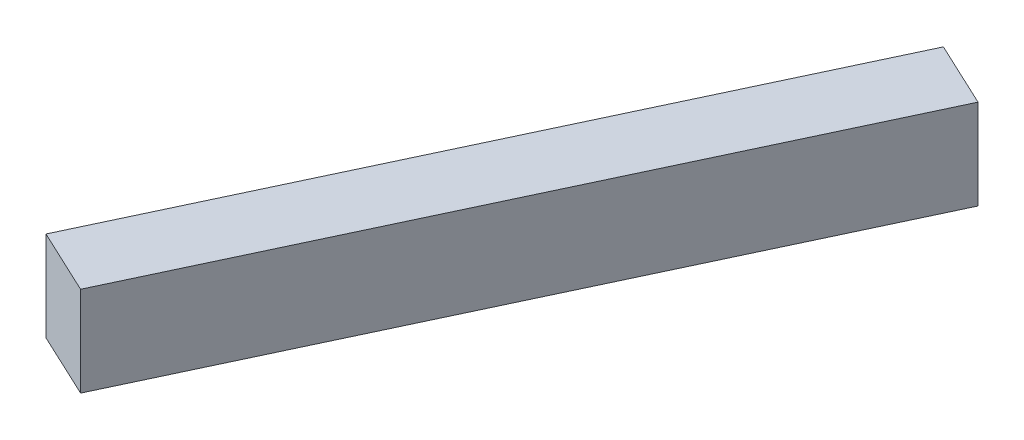
ISO-10303-21;
HEADER;
FILE_DESCRIPTION(('STEP AP214'),'2;1');
FILE_NAME('part.step','',(''),(''),'','','');
FILE_SCHEMA(('AUTOMOTIVE_DESIGN { 1 0 10303 214 1 1 1 1 }'));
ENDSEC;
DATA;
#1=APPLICATION_CONTEXT('core data for automotive mechanical design processes');
#2=APPLICATION_PROTOCOL_DEFINITION('international standard','automotive_design',2000,#1);
#3=PRODUCT_CONTEXT('',#1,'mechanical');
#4=PRODUCT('Part','Part','',(#3));
#5=PRODUCT_RELATED_PRODUCT_CATEGORY('part','',(#4));
#6=PRODUCT_DEFINITION_FORMATION('','',#4);
#7=PRODUCT_DEFINITION_CONTEXT('part definition',#1,'design');
#8=PRODUCT_DEFINITION('design','',#6,#7);
#9=PRODUCT_DEFINITION_SHAPE('','',#8);
#10=(LENGTH_UNIT() NAMED_UNIT(*) SI_UNIT(.MILLI.,.METRE.));
#11=(NAMED_UNIT(*) PLANE_ANGLE_UNIT() SI_UNIT($,.RADIAN.));
#12=(NAMED_UNIT(*) SI_UNIT($,.STERADIAN.) SOLID_ANGLE_UNIT());
#13=UNCERTAINTY_MEASURE_WITH_UNIT(LENGTH_MEASURE(1.E-05),#10,'distance_accuracy_value','');
#14=(GEOMETRIC_REPRESENTATION_CONTEXT(3) GLOBAL_UNCERTAINTY_ASSIGNED_CONTEXT((#13)) GLOBAL_UNIT_ASSIGNED_CONTEXT((#10,
#11,#12)) REPRESENTATION_CONTEXT('',''));
#15=CARTESIAN_POINT('',(0.,0.,0.));
#16=DIRECTION('',(0.,0.,1.));
#17=DIRECTION('',(1.,0.,0.));
#18=AXIS2_PLACEMENT_3D('',#15,#16,#17);
#19=CARTESIAN_POINT('',(-7.55429976562893,7.874,16.3351132916802));
#20=DIRECTION('',(-0.905257601319804,0.,-0.424863125315336));
#21=DIRECTION('',(-0.424863125315336,0.,0.905257601319804));
#22=AXIS2_PLACEMENT_3D('',#19,#20,#21);
#23=PLANE('',#22);
#24=DIRECTION('',(0.,1.,0.));
#25=VECTOR('',#24,1.);
#26=CARTESIAN_POINT('',(-7.55429976562893,7.874,16.3351132916802));
#27=LINE('',#26,#25);
#28=CARTESIAN_POINT('',(-7.55429976562893,7.62,16.3351132916802));
#29=VERTEX_POINT('',#28);
#30=CARTESIAN_POINT('',(-7.55429976562893,7.874,16.3351132916802));
#31=VERTEX_POINT('',#30);
#32=EDGE_CURVE('E20',#29,#31,#27,.T.);
#33=ORIENTED_EDGE('',*,*,#32,.T.);
#34=DIRECTION('',(0.42486312531534,0.,-0.905257601319802));
#35=VECTOR('',#34,1.);
#36=CARTESIAN_POINT('',(-8.36366401935464,7.874,18.0596290221944));
#37=LINE('',#36,#35);
#38=CARTESIAN_POINT('',(-8.36366401935464,7.874,18.0596290221944));
#39=VERTEX_POINT('',#38);
#40=EDGE_CURVE('E55',#39,#31,#37,.T.);
#41=ORIENTED_EDGE('',*,*,#40,.F.);
#42=DIRECTION('',(0.,1.,0.));
#43=VECTOR('',#42,1.);
#44=CARTESIAN_POINT('',(-8.36366401935464,7.874,18.0596290221944));
#45=LINE('',#44,#43);
#46=CARTESIAN_POINT('',(-8.36366401935464,7.62,18.0596290221944));
#47=VERTEX_POINT('',#46);
#48=EDGE_CURVE('E76',#39,#47,#45,.F.);
#49=ORIENTED_EDGE('',*,*,#48,.T.);
#50=DIRECTION('',(0.42486312531534,0.,-0.905257601319802));
#51=VECTOR('',#50,1.);
#52=CARTESIAN_POINT('',(-8.36366401935464,7.62,18.0596290221944));
#53=LINE('',#52,#51);
#54=EDGE_CURVE('E58',#47,#29,#53,.T.);
#55=ORIENTED_EDGE('',*,*,#54,.T.);
#56=EDGE_LOOP('',(#33,#41,#49,#55));
#57=FACE_BOUND('',#56,.T.);
#58=ADVANCED_FACE('F17',(#57),#23,.F.);
#59=CARTESIAN_POINT('',(-7.55429976562893,7.874,16.3351132916802));
#60=DIRECTION('',(-0.424863125315341,0.,0.905257601319802));
#61=DIRECTION('',(0.905257601319802,0.,0.424863125315341));
#62=AXIS2_PLACEMENT_3D('',#59,#60,#61);
#63=PLANE('',#62);
#64=DIRECTION('',(0.,1.,0.));
#65=VECTOR('',#64,1.);
#66=CARTESIAN_POINT('',(-7.73824811021711,7.874,16.2487811046161));
#67=LINE('',#66,#65);
#68=CARTESIAN_POINT('',(-7.73824811021712,7.62,16.2487811046161));
#69=VERTEX_POINT('',#68);
#70=CARTESIAN_POINT('',(-7.73824811021712,7.874,16.2487811046161));
#71=VERTEX_POINT('',#70);
#72=EDGE_CURVE('E73',#69,#71,#67,.T.);
#73=ORIENTED_EDGE('',*,*,#72,.T.);
#74=DIRECTION('',(-0.905257601319752,0.,-0.424863125315447));
#75=VECTOR('',#74,1.);
#76=CARTESIAN_POINT('',(-7.55429976562893,7.874,16.3351132916802));
#77=LINE('',#76,#75);
#78=EDGE_CURVE('E63',#31,#71,#77,.T.);
#79=ORIENTED_EDGE('',*,*,#78,.F.);
#80=ORIENTED_EDGE('',*,*,#32,.F.);
#81=DIRECTION('',(-0.905257601319752,0.,-0.424863125315447));
#82=VECTOR('',#81,1.);
#83=CARTESIAN_POINT('',(-7.55429976562893,7.62,16.3351132916802));
#84=LINE('',#83,#82);
#85=EDGE_CURVE('E80',#29,#69,#84,.T.);
#86=ORIENTED_EDGE('',*,*,#85,.T.);
#87=EDGE_LOOP('',(#73,#79,#80,#86));
#88=FACE_BOUND('',#87,.T.);
#89=ADVANCED_FACE('F72',(#88),#63,.F.);
#90=CARTESIAN_POINT('',(-7.73824811021711,7.874,16.2487811046161));
#91=DIRECTION('',(0.,1.,0.));
#92=DIRECTION('',(0.,0.,1.));
#93=AXIS2_PLACEMENT_3D('',#90,#91,#92);
#94=PLANE('',#93);
#95=DIRECTION('',(-0.905257601966584,0.,-0.424863123937239));
#96=VECTOR('',#95,1.);
#97=CARTESIAN_POINT('',(-8.36366401935464,7.874,18.0596290221944));
#98=LINE('',#97,#96);
#99=CARTESIAN_POINT('',(-8.54761236407425,7.874,17.9732968354104));
#100=VERTEX_POINT('',#99);
#101=EDGE_CURVE('E69',#100,#39,#98,.F.);
#102=ORIENTED_EDGE('',*,*,#101,.T.);
#103=ORIENTED_EDGE('',*,*,#40,.T.);
#104=ORIENTED_EDGE('',*,*,#78,.T.);
#105=DIRECTION('',(0.424863125315337,0.,-0.905257601319804));
#106=VECTOR('',#105,1.);
#107=CARTESIAN_POINT('',(-7.73824811021711,7.874,16.2487811046161));
#108=LINE('',#107,#106);
#109=EDGE_CURVE('E83',#71,#100,#108,.F.);
#110=ORIENTED_EDGE('',*,*,#109,.T.);
#111=EDGE_LOOP('',(#102,#103,#104,#110));
#112=FACE_BOUND('',#111,.T.);
#113=ADVANCED_FACE('F66',(#112),#94,.T.);
#114=CARTESIAN_POINT('',(-8.36366401935464,7.874,18.0596290221944));
#115=DIRECTION('',(0.424863123937239,0.,-0.905257601966584));
#116=DIRECTION('',(-0.905257601966584,0.,-0.424863123937239));
#117=AXIS2_PLACEMENT_3D('',#114,#115,#116);
#118=PLANE('',#117);
#119=ORIENTED_EDGE('',*,*,#48,.F.);
#120=ORIENTED_EDGE('',*,*,#101,.F.);
#121=DIRECTION('',(0.,1.,0.));
#122=VECTOR('',#121,1.);
#123=CARTESIAN_POINT('',(-8.54761236407427,7.874,17.9732968354104));
#124=LINE('',#123,#122);
#125=CARTESIAN_POINT('',(-8.54761236407425,7.62,17.9732968354104));
#126=VERTEX_POINT('',#125);
#127=EDGE_CURVE('E26',#100,#126,#124,.F.);
#128=ORIENTED_EDGE('',*,*,#127,.T.);
#129=DIRECTION('',(0.905257601966681,0.,0.424863123937033));
#130=VECTOR('',#129,1.);
#131=CARTESIAN_POINT('',(-8.54761236407425,7.62,17.9732968354104));
#132=LINE('',#131,#130);
#133=EDGE_CURVE('E34',#126,#47,#132,.T.);
#134=ORIENTED_EDGE('',*,*,#133,.T.);
#135=EDGE_LOOP('',(#119,#120,#128,#134));
#136=FACE_BOUND('',#135,.T.);
#137=ADVANCED_FACE('F88',(#136),#118,.F.);
#138=CARTESIAN_POINT('',(-7.73824811021711,7.62,16.2487811046161));
#139=DIRECTION('',(0.,1.,0.));
#140=DIRECTION('',(0.,0.,1.));
#141=AXIS2_PLACEMENT_3D('',#138,#139,#140);
#142=PLANE('',#141);
#143=ORIENTED_EDGE('',*,*,#54,.F.);
#144=ORIENTED_EDGE('',*,*,#133,.F.);
#145=DIRECTION('',(0.424863125315337,0.,-0.905257601319804));
#146=VECTOR('',#145,1.);
#147=CARTESIAN_POINT('',(-7.73824811021711,7.62,16.2487811046161));
#148=LINE('',#147,#146);
#149=EDGE_CURVE('E11',#126,#69,#148,.T.);
#150=ORIENTED_EDGE('',*,*,#149,.T.);
#151=ORIENTED_EDGE('',*,*,#85,.F.);
#152=EDGE_LOOP('',(#143,#144,#150,#151));
#153=FACE_BOUND('',#152,.T.);
#154=ADVANCED_FACE('F91',(#153),#142,.F.);
#155=CARTESIAN_POINT('',(-7.73824811021711,7.874,16.2487811046161));
#156=DIRECTION('',(0.905257601319804,0.,0.424863125315337));
#157=DIRECTION('',(0.424863125315337,0.,-0.905257601319804));
#158=AXIS2_PLACEMENT_3D('',#155,#156,#157);
#159=PLANE('',#158);
#160=ORIENTED_EDGE('',*,*,#127,.F.);
#161=ORIENTED_EDGE('',*,*,#109,.F.);
#162=ORIENTED_EDGE('',*,*,#72,.F.);
#163=ORIENTED_EDGE('',*,*,#149,.F.);
#164=EDGE_LOOP('',(#160,#161,#162,#163));
#165=FACE_BOUND('',#164,.T.);
#166=ADVANCED_FACE('F90',(#165),#159,.F.);
#167=CLOSED_SHELL('',(#58,#89,#113,#137,#154,#166));
#168=MANIFOLD_SOLID_BREP('B1',#167);
#169=ADVANCED_BREP_SHAPE_REPRESENTATION('',(#18,#168),#14);
#170=SHAPE_DEFINITION_REPRESENTATION(#9,#169);
ENDSEC;
END-ISO-10303-21;
